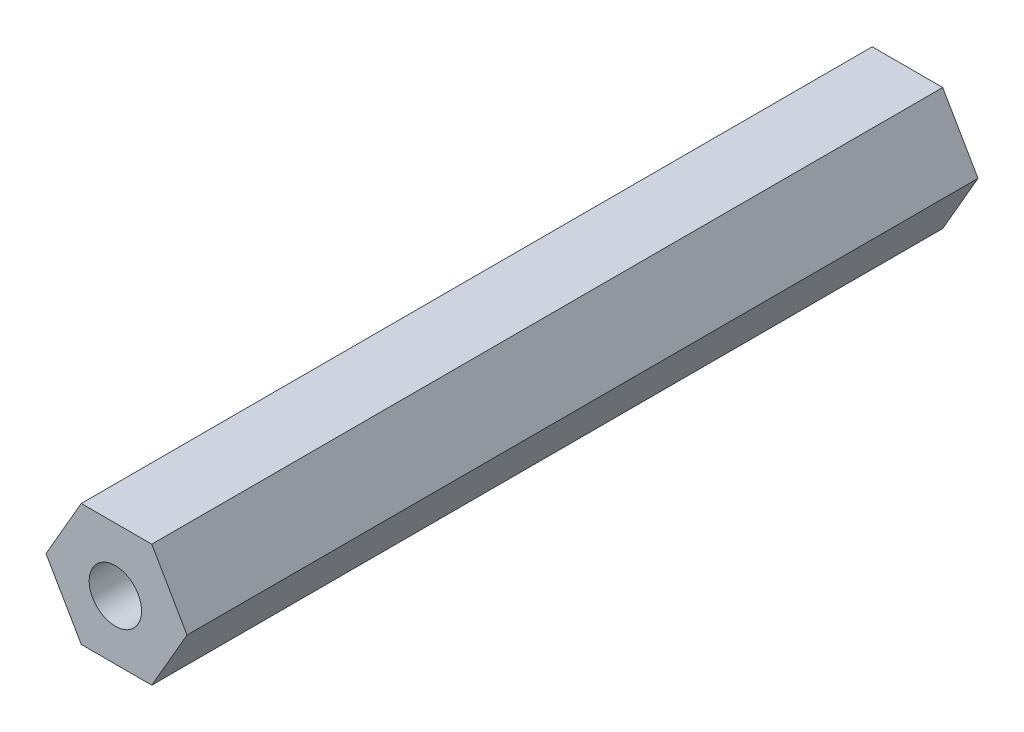
ISO-10303-21;
HEADER;
FILE_DESCRIPTION(('STEP AP214'),'2;1');
FILE_NAME('part.step','',(''),(''),'','','');
FILE_SCHEMA(('AUTOMOTIVE_DESIGN { 1 0 10303 214 1 1 1 1 }'));
ENDSEC;
DATA;
#1=APPLICATION_CONTEXT('core data for automotive mechanical design processes');
#2=APPLICATION_PROTOCOL_DEFINITION('international standard','automotive_design',2000,#1);
#3=PRODUCT_CONTEXT('',#1,'mechanical');
#4=PRODUCT('Part','Part','',(#3));
#5=PRODUCT_RELATED_PRODUCT_CATEGORY('part','',(#4));
#6=PRODUCT_DEFINITION_FORMATION('','',#4);
#7=PRODUCT_DEFINITION_CONTEXT('part definition',#1,'design');
#8=PRODUCT_DEFINITION('design','',#6,#7);
#9=PRODUCT_DEFINITION_SHAPE('','',#8);
#10=(LENGTH_UNIT() NAMED_UNIT(*) SI_UNIT(.MILLI.,.METRE.));
#11=(NAMED_UNIT(*) PLANE_ANGLE_UNIT() SI_UNIT($,.RADIAN.));
#12=(NAMED_UNIT(*) SI_UNIT($,.STERADIAN.) SOLID_ANGLE_UNIT());
#13=UNCERTAINTY_MEASURE_WITH_UNIT(LENGTH_MEASURE(1.E-05),#10,'distance_accuracy_value','');
#14=(GEOMETRIC_REPRESENTATION_CONTEXT(3) GLOBAL_UNCERTAINTY_ASSIGNED_CONTEXT((#13)) GLOBAL_UNIT_ASSIGNED_CONTEXT((#10,
#11,#12)) REPRESENTATION_CONTEXT('',''));
#15=CARTESIAN_POINT('',(0.,0.,0.));
#16=DIRECTION('',(0.,0.,1.));
#17=DIRECTION('',(1.,0.,0.));
#18=AXIS2_PLACEMENT_3D('',#15,#16,#17);
#19=CARTESIAN_POINT('',(1.81865334794732,-3.15,-25.4));
#20=DIRECTION('',(0.866025403784439,-0.5,0.));
#21=DIRECTION('',(0.5,0.866025403784439,0.));
#22=AXIS2_PLACEMENT_3D('',#19,#20,#21);
#23=PLANE('',#22);
#24=DIRECTION('',(-0.5,-0.866025403784439,0.));
#25=VECTOR('',#24,1.);
#26=CARTESIAN_POINT('',(3.63730669589464,0.,15.4));
#27=LINE('',#26,#25);
#28=CARTESIAN_POINT('',(3.63730669589464,0.,15.4));
#29=VERTEX_POINT('',#28);
#30=CARTESIAN_POINT('',(1.81865334794732,-3.15,15.4));
#31=VERTEX_POINT('',#30);
#32=EDGE_CURVE('E50',#29,#31,#27,.T.);
#33=ORIENTED_EDGE('',*,*,#32,.T.);
#34=DIRECTION('',(0.,0.,1.));
#35=VECTOR('',#34,1.);
#36=CARTESIAN_POINT('',(1.81865334794732,-3.15,-25.4));
#37=LINE('',#36,#35);
#38=CARTESIAN_POINT('',(1.81865334794732,-3.15,-25.4));
#39=VERTEX_POINT('',#38);
#40=EDGE_CURVE('E57',#39,#31,#37,.T.);
#41=ORIENTED_EDGE('',*,*,#40,.F.);
#42=DIRECTION('',(0.5,0.866025403784438,0.));
#43=VECTOR('',#42,1.);
#44=CARTESIAN_POINT('',(1.81865334794732,-3.15,-25.4));
#45=LINE('',#44,#43);
#46=CARTESIAN_POINT('',(3.63730669589464,0.,-25.4));
#47=VERTEX_POINT('',#46);
#48=EDGE_CURVE('E140',#39,#47,#45,.T.);
#49=ORIENTED_EDGE('',*,*,#48,.T.);
#50=DIRECTION('',(0.,0.,1.));
#51=VECTOR('',#50,1.);
#52=CARTESIAN_POINT('',(3.63730669589464,0.,-25.4));
#53=LINE('',#52,#51);
#54=EDGE_CURVE('E120',#47,#29,#53,.T.);
#55=ORIENTED_EDGE('',*,*,#54,.T.);
#56=EDGE_LOOP('',(#33,#41,#49,#55));
#57=FACE_BOUND('',#56,.T.);
#58=ADVANCED_FACE('F34',(#57),#23,.T.);
#59=CARTESIAN_POINT('',(-1.81865334794732,-3.15,-25.4));
#60=DIRECTION('',(0.,-1.,0.));
#61=DIRECTION('',(1.,0.,0.));
#62=AXIS2_PLACEMENT_3D('',#59,#60,#61);
#63=PLANE('',#62);
#64=DIRECTION('',(-1.,0.,0.));
#65=VECTOR('',#64,1.);
#66=CARTESIAN_POINT('',(3.63730669589464,-3.15,15.4));
#67=LINE('',#66,#65);
#68=CARTESIAN_POINT('',(-1.81865334794732,-3.15,15.4));
#69=VERTEX_POINT('',#68);
#70=EDGE_CURVE('E142',#31,#69,#67,.T.);
#71=ORIENTED_EDGE('',*,*,#70,.T.);
#72=DIRECTION('',(0.,0.,1.));
#73=VECTOR('',#72,1.);
#74=CARTESIAN_POINT('',(-1.81865334794732,-3.15,-25.4));
#75=LINE('',#74,#73);
#76=CARTESIAN_POINT('',(-1.81865334794732,-3.15,-25.4));
#77=VERTEX_POINT('',#76);
#78=EDGE_CURVE('E105',#77,#69,#75,.T.);
#79=ORIENTED_EDGE('',*,*,#78,.F.);
#80=DIRECTION('',(1.,0.,0.));
#81=VECTOR('',#80,1.);
#82=CARTESIAN_POINT('',(-1.81865334794732,-3.15,-25.4));
#83=LINE('',#82,#81);
#84=EDGE_CURVE('E123',#77,#39,#83,.T.);
#85=ORIENTED_EDGE('',*,*,#84,.T.);
#86=ORIENTED_EDGE('',*,*,#40,.T.);
#87=EDGE_LOOP('',(#71,#79,#85,#86));
#88=FACE_BOUND('',#87,.T.);
#89=ADVANCED_FACE('F157',(#88),#63,.T.);
#90=CARTESIAN_POINT('',(-3.63730669589464,0.,-25.4));
#91=DIRECTION('',(-0.866025403784439,-0.5,0.));
#92=DIRECTION('',(0.5,-0.866025403784439,0.));
#93=AXIS2_PLACEMENT_3D('',#90,#91,#92);
#94=PLANE('',#93);
#95=DIRECTION('',(-0.5,0.866025403784439,0.));
#96=VECTOR('',#95,1.);
#97=CARTESIAN_POINT('',(-1.81865334794732,-3.15,15.4));
#98=LINE('',#97,#96);
#99=CARTESIAN_POINT('',(-3.63730669589464,0.,15.4));
#100=VERTEX_POINT('',#99);
#101=EDGE_CURVE('E91',#69,#100,#98,.T.);
#102=ORIENTED_EDGE('',*,*,#101,.T.);
#103=DIRECTION('',(0.,0.,1.));
#104=VECTOR('',#103,1.);
#105=CARTESIAN_POINT('',(-3.63730669589464,0.,-25.4));
#106=LINE('',#105,#104);
#107=CARTESIAN_POINT('',(-3.63730669589464,0.,-25.4));
#108=VERTEX_POINT('',#107);
#109=EDGE_CURVE('E103',#108,#100,#106,.T.);
#110=ORIENTED_EDGE('',*,*,#109,.F.);
#111=DIRECTION('',(0.5,-0.866025403784439,0.));
#112=VECTOR('',#111,1.);
#113=CARTESIAN_POINT('',(-3.63730669589464,0.,-25.4));
#114=LINE('',#113,#112);
#115=EDGE_CURVE('E131',#108,#77,#114,.T.);
#116=ORIENTED_EDGE('',*,*,#115,.T.);
#117=ORIENTED_EDGE('',*,*,#78,.T.);
#118=EDGE_LOOP('',(#102,#110,#116,#117));
#119=FACE_BOUND('',#118,.T.);
#120=ADVANCED_FACE('F101',(#119),#94,.T.);
#121=CARTESIAN_POINT('',(-1.81865334794732,3.15,-25.4));
#122=DIRECTION('',(-0.866025403784439,0.5,0.));
#123=DIRECTION('',(-0.5,-0.866025403784439,0.));
#124=AXIS2_PLACEMENT_3D('',#121,#122,#123);
#125=PLANE('',#124);
#126=DIRECTION('',(0.5,0.866025403784439,0.));
#127=VECTOR('',#126,1.);
#128=CARTESIAN_POINT('',(-1.81865334794732,3.15,15.4));
#129=LINE('',#128,#127);
#130=CARTESIAN_POINT('',(-1.81865334794732,3.15,15.4));
#131=VERTEX_POINT('',#130);
#132=EDGE_CURVE('E87',#100,#131,#129,.T.);
#133=ORIENTED_EDGE('',*,*,#132,.T.);
#134=DIRECTION('',(0.,0.,1.));
#135=VECTOR('',#134,1.);
#136=CARTESIAN_POINT('',(-1.81865334794732,3.15,-25.4));
#137=LINE('',#136,#135);
#138=CARTESIAN_POINT('',(-1.81865334794732,3.15,-25.4));
#139=VERTEX_POINT('',#138);
#140=EDGE_CURVE('E111',#139,#131,#137,.T.);
#141=ORIENTED_EDGE('',*,*,#140,.F.);
#142=DIRECTION('',(-0.5,-0.866025403784438,0.));
#143=VECTOR('',#142,1.);
#144=CARTESIAN_POINT('',(-1.81865334794732,3.15,-25.4));
#145=LINE('',#144,#143);
#146=EDGE_CURVE('E110',#139,#108,#145,.T.);
#147=ORIENTED_EDGE('',*,*,#146,.T.);
#148=ORIENTED_EDGE('',*,*,#109,.T.);
#149=EDGE_LOOP('',(#133,#141,#147,#148));
#150=FACE_BOUND('',#149,.T.);
#151=ADVANCED_FACE('F108',(#150),#125,.T.);
#152=CARTESIAN_POINT('',(1.81865334794732,3.15,-25.4));
#153=DIRECTION('',(0.,1.,0.));
#154=DIRECTION('',(0.,0.,1.));
#155=AXIS2_PLACEMENT_3D('',#152,#153,#154);
#156=PLANE('',#155);
#157=DIRECTION('',(1.,0.,0.));
#158=VECTOR('',#157,1.);
#159=CARTESIAN_POINT('',(3.63730669589464,3.15,15.4));
#160=LINE('',#159,#158);
#161=CARTESIAN_POINT('',(1.81865334794732,3.15,15.4));
#162=VERTEX_POINT('',#161);
#163=EDGE_CURVE('E94',#131,#162,#160,.T.);
#164=ORIENTED_EDGE('',*,*,#163,.T.);
#165=DIRECTION('',(0.,0.,1.));
#166=VECTOR('',#165,1.);
#167=CARTESIAN_POINT('',(1.81865334794732,3.15,-25.4));
#168=LINE('',#167,#166);
#169=CARTESIAN_POINT('',(1.81865334794732,3.15,-25.4));
#170=VERTEX_POINT('',#169);
#171=EDGE_CURVE('E114',#170,#162,#168,.T.);
#172=ORIENTED_EDGE('',*,*,#171,.F.);
#173=DIRECTION('',(-1.,0.,0.));
#174=VECTOR('',#173,1.);
#175=CARTESIAN_POINT('',(1.81865334794732,3.15,-25.4));
#176=LINE('',#175,#174);
#177=EDGE_CURVE('E134',#170,#139,#176,.T.);
#178=ORIENTED_EDGE('',*,*,#177,.T.);
#179=ORIENTED_EDGE('',*,*,#140,.T.);
#180=EDGE_LOOP('',(#164,#172,#178,#179));
#181=FACE_BOUND('',#180,.T.);
#182=ADVANCED_FACE('F148',(#181),#156,.T.);
#183=CARTESIAN_POINT('',(3.63730669589464,0.,-25.4));
#184=DIRECTION('',(0.866025403784438,0.5,0.));
#185=DIRECTION('',(-0.5,0.866025403784438,0.));
#186=AXIS2_PLACEMENT_3D('',#183,#184,#185);
#187=PLANE('',#186);
#188=DIRECTION('',(0.5,-0.866025403784439,0.));
#189=VECTOR('',#188,1.);
#190=CARTESIAN_POINT('',(3.63730669589464,0.,15.4));
#191=LINE('',#190,#189);
#192=EDGE_CURVE('E145',#162,#29,#191,.T.);
#193=ORIENTED_EDGE('',*,*,#192,.T.);
#194=ORIENTED_EDGE('',*,*,#54,.F.);
#195=DIRECTION('',(-0.5,0.866025403784438,0.));
#196=VECTOR('',#195,1.);
#197=CARTESIAN_POINT('',(3.63730669589464,0.,-25.4));
#198=LINE('',#197,#196);
#199=EDGE_CURVE('E137',#47,#170,#198,.T.);
#200=ORIENTED_EDGE('',*,*,#199,.T.);
#201=ORIENTED_EDGE('',*,*,#171,.T.);
#202=EDGE_LOOP('',(#193,#194,#200,#201));
#203=FACE_BOUND('',#202,.T.);
#204=ADVANCED_FACE('F151',(#203),#187,.T.);
#205=CARTESIAN_POINT('',(3.63730669589464,0.,-25.4));
#206=DIRECTION('',(0.,0.,1.));
#207=DIRECTION('',(1.,0.,0.));
#208=AXIS2_PLACEMENT_3D('',#205,#206,#207);
#209=PLANE('',#208);
#210=CARTESIAN_POINT('',(-0.0587533379232065,-0.101763766397256,-25.4));
#211=DIRECTION('',(0.,0.,1.));
#212=DIRECTION('',(1.,0.,0.));
#213=AXIS2_PLACEMENT_3D('',#210,#211,#212);
#214=CIRCLE('',#213,1.85254999999999);
#215=CARTESIAN_POINT('',(1.79379666207678,-0.101763766397256,-25.4));
#216=VERTEX_POINT('',#215);
#217=EDGE_CURVE('E43',#216,#216,#214,.T.);
#218=ORIENTED_EDGE('',*,*,#217,.T.);
#219=EDGE_LOOP('',(#218));
#220=FACE_BOUND('',#219,.T.);
#221=ORIENTED_EDGE('',*,*,#48,.F.);
#222=ORIENTED_EDGE('',*,*,#84,.F.);
#223=ORIENTED_EDGE('',*,*,#115,.F.);
#224=ORIENTED_EDGE('',*,*,#146,.F.);
#225=ORIENTED_EDGE('',*,*,#177,.F.);
#226=ORIENTED_EDGE('',*,*,#199,.F.);
#227=EDGE_LOOP('',(#221,#222,#223,#224,#225,#226));
#228=FACE_BOUND('',#227,.T.);
#229=ADVANCED_FACE('F154',(#220,#228),#209,.F.);
#230=CARTESIAN_POINT('',(-0.0587533379232065,-0.101763766397256,25.4));
#231=DIRECTION('',(0.,0.,1.));
#232=DIRECTION('',(1.,0.,0.));
#233=AXIS2_PLACEMENT_3D('',#230,#231,#232);
#234=CYLINDRICAL_SURFACE('',#233,1.35254999999999);
#235=CARTESIAN_POINT('',(-0.0587533379232065,-0.101763766397256,15.4));
#236=DIRECTION('',(0.,0.,-1.));
#237=DIRECTION('',(-1.,0.,0.));
#238=AXIS2_PLACEMENT_3D('',#235,#236,#237);
#239=CIRCLE('',#238,1.35254999999999);
#240=CARTESIAN_POINT('',(-1.4113033379232,-0.101763766397256,15.4));
#241=VERTEX_POINT('',#240);
#242=EDGE_CURVE('E38',#241,#241,#239,.F.);
#243=ORIENTED_EDGE('',*,*,#242,.T.);
#244=EDGE_LOOP('',(#243));
#245=FACE_BOUND('',#244,.T.);
#246=CARTESIAN_POINT('',(-0.0587533379232065,-0.101763766397256,-24.9));
#247=DIRECTION('',(0.,0.,1.));
#248=DIRECTION('',(1.,0.,0.));
#249=AXIS2_PLACEMENT_3D('',#246,#247,#248);
#250=CIRCLE('',#249,1.35254999999999);
#251=CARTESIAN_POINT('',(1.29379666207678,-0.101763766397256,-24.9));
#252=VERTEX_POINT('',#251);
#253=EDGE_CURVE('E11',#252,#252,#250,.F.);
#254=ORIENTED_EDGE('',*,*,#253,.T.);
#255=EDGE_LOOP('',(#254));
#256=FACE_BOUND('',#255,.T.);
#257=ADVANCED_FACE('F173',(#245,#256),#234,.F.);
#258=CARTESIAN_POINT('',(-0.0587533379232065,-0.101763766397256,-25.4));
#259=DIRECTION('',(0.,0.,-1.));
#260=DIRECTION('',(-1.,0.,0.));
#261=AXIS2_PLACEMENT_3D('',#258,#259,#260);
#262=CONICAL_SURFACE('',#261,1.85254999999999,0.785398163397439);
#263=ORIENTED_EDGE('',*,*,#253,.F.);
#264=EDGE_LOOP('',(#263));
#265=FACE_BOUND('',#264,.T.);
#266=ORIENTED_EDGE('',*,*,#217,.F.);
#267=EDGE_LOOP('',(#266));
#268=FACE_BOUND('',#267,.T.);
#269=ADVANCED_FACE('F36',(#265,#268),#262,.F.);
#270=CARTESIAN_POINT('',(0.,0.,15.4));
#271=DIRECTION('',(0.,0.,-1.));
#272=DIRECTION('',(-1.,0.,0.));
#273=AXIS2_PLACEMENT_3D('',#270,#271,#272);
#274=PLANE('',#273);
#275=ORIENTED_EDGE('',*,*,#101,.F.);
#276=ORIENTED_EDGE('',*,*,#70,.F.);
#277=ORIENTED_EDGE('',*,*,#32,.F.);
#278=ORIENTED_EDGE('',*,*,#192,.F.);
#279=ORIENTED_EDGE('',*,*,#163,.F.);
#280=ORIENTED_EDGE('',*,*,#132,.F.);
#281=EDGE_LOOP('',(#275,#276,#277,#278,#279,#280));
#282=FACE_BOUND('',#281,.T.);
#283=ORIENTED_EDGE('',*,*,#242,.F.);
#284=EDGE_LOOP('',(#283));
#285=FACE_BOUND('',#284,.T.);
#286=ADVANCED_FACE('F89',(#282,#285),#274,.F.);
#287=CLOSED_SHELL('',(#58,#89,#120,#151,#182,#204,#229,#257,#269,#286));
#288=MANIFOLD_SOLID_BREP('B2',#287);
#289=ADVANCED_BREP_SHAPE_REPRESENTATION('',(#18,#288),#14);
#290=SHAPE_DEFINITION_REPRESENTATION(#9,#289);
ENDSEC;
END-ISO-10303-21;
